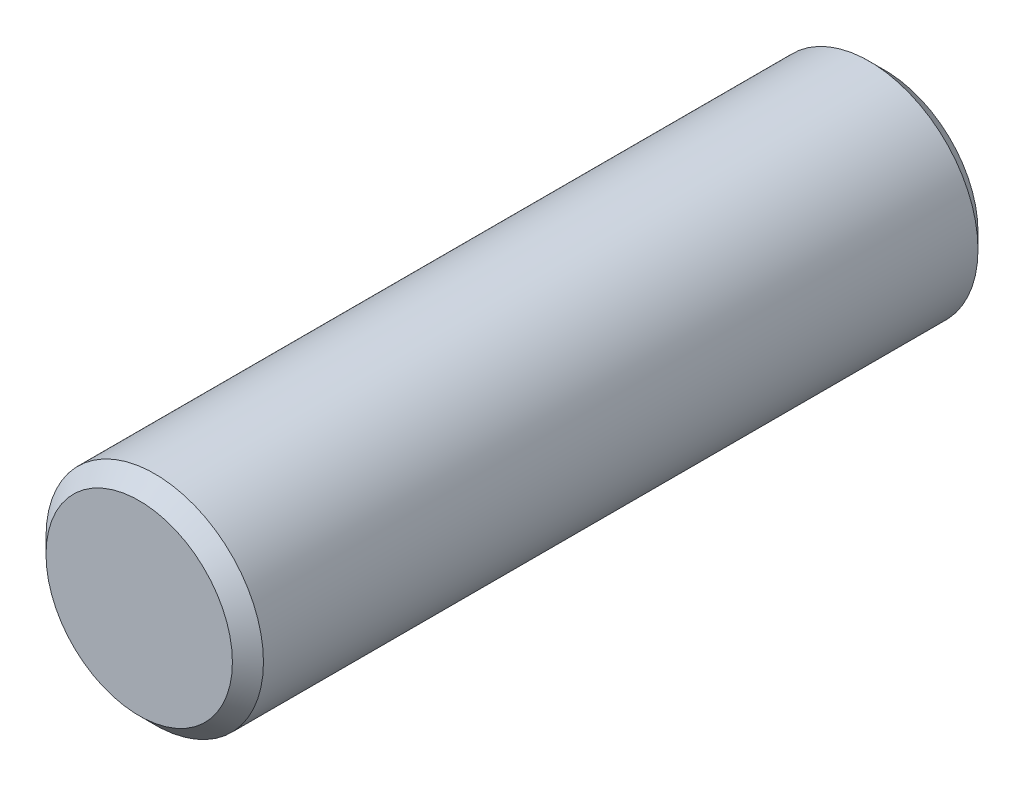
ISO-10303-21;
HEADER;
FILE_DESCRIPTION(('STEP AP214'),'2;1');
FILE_NAME('part.step','',(''),(''),'','','');
FILE_SCHEMA(('AUTOMOTIVE_DESIGN { 1 0 10303 214 1 1 1 1 }'));
ENDSEC;
DATA;
#1=APPLICATION_CONTEXT('core data for automotive mechanical design processes');
#2=APPLICATION_PROTOCOL_DEFINITION('international standard','automotive_design',2000,#1);
#3=PRODUCT_CONTEXT('',#1,'mechanical');
#4=PRODUCT('Part','Part','',(#3));
#5=PRODUCT_RELATED_PRODUCT_CATEGORY('part','',(#4));
#6=PRODUCT_DEFINITION_FORMATION('','',#4);
#7=PRODUCT_DEFINITION_CONTEXT('part definition',#1,'design');
#8=PRODUCT_DEFINITION('design','',#6,#7);
#9=PRODUCT_DEFINITION_SHAPE('','',#8);
#10=(LENGTH_UNIT() NAMED_UNIT(*) SI_UNIT(.MILLI.,.METRE.));
#11=(NAMED_UNIT(*) PLANE_ANGLE_UNIT() SI_UNIT($,.RADIAN.));
#12=(NAMED_UNIT(*) SI_UNIT($,.STERADIAN.) SOLID_ANGLE_UNIT());
#13=UNCERTAINTY_MEASURE_WITH_UNIT(LENGTH_MEASURE(1.E-05),#10,'distance_accuracy_value','');
#14=(GEOMETRIC_REPRESENTATION_CONTEXT(3) GLOBAL_UNCERTAINTY_ASSIGNED_CONTEXT((#13)) GLOBAL_UNIT_ASSIGNED_CONTEXT((#10,
#11,#12)) REPRESENTATION_CONTEXT('',''));
#15=CARTESIAN_POINT('',(0.,0.,0.));
#16=DIRECTION('',(0.,0.,1.));
#17=DIRECTION('',(1.,0.,0.));
#18=AXIS2_PLACEMENT_3D('',#15,#16,#17);
#19=CARTESIAN_POINT('',(0.,0.,24.));
#20=DIRECTION('',(0.,0.,-1.));
#21=DIRECTION('',(-1.,0.,0.));
#22=AXIS2_PLACEMENT_3D('',#19,#20,#21);
#23=CYLINDRICAL_SURFACE('',#22,3.5);
#24=CARTESIAN_POINT('',(0.,0.,23.5));
#25=DIRECTION('',(0.,0.,1.));
#26=DIRECTION('',(1.,0.,0.));
#27=AXIS2_PLACEMENT_3D('',#24,#25,#26);
#28=CIRCLE('',#27,3.5);
#29=CARTESIAN_POINT('',(3.5,0.,23.5));
#30=VERTEX_POINT('',#29);
#31=EDGE_CURVE('E38',#30,#30,#28,.F.);
#32=ORIENTED_EDGE('',*,*,#31,.T.);
#33=EDGE_LOOP('',(#32));
#34=FACE_BOUND('',#33,.T.);
#35=CARTESIAN_POINT('',(0.,0.,0.500000000000004));
#36=DIRECTION('',(0.,0.,1.));
#37=DIRECTION('',(1.,0.,0.));
#38=AXIS2_PLACEMENT_3D('',#35,#36,#37);
#39=CIRCLE('',#38,3.5);
#40=CARTESIAN_POINT('',(3.5,0.,0.500000000000004));
#41=VERTEX_POINT('',#40);
#42=EDGE_CURVE('E42',#41,#41,#39,.T.);
#43=ORIENTED_EDGE('',*,*,#42,.T.);
#44=EDGE_LOOP('',(#43));
#45=FACE_BOUND('',#44,.T.);
#46=ADVANCED_FACE('F31',(#34,#45),#23,.T.);
#47=CARTESIAN_POINT('',(0.,0.,24.));
#48=DIRECTION('',(0.,0.,1.));
#49=DIRECTION('',(1.,0.,0.));
#50=AXIS2_PLACEMENT_3D('',#47,#48,#49);
#51=PLANE('',#50);
#52=CARTESIAN_POINT('',(0.,0.,24.));
#53=DIRECTION('',(0.,0.,1.));
#54=DIRECTION('',(1.,0.,0.));
#55=AXIS2_PLACEMENT_3D('',#52,#53,#54);
#56=CIRCLE('',#55,3.);
#57=CARTESIAN_POINT('',(3.,0.,24.));
#58=VERTEX_POINT('',#57);
#59=EDGE_CURVE('E46',#58,#58,#56,.T.);
#60=ORIENTED_EDGE('',*,*,#59,.T.);
#61=EDGE_LOOP('',(#60));
#62=FACE_BOUND('',#61,.T.);
#63=ADVANCED_FACE('F52',(#62),#51,.T.);
#64=CARTESIAN_POINT('',(0.,0.,0.));
#65=DIRECTION('',(0.,0.,1.));
#66=DIRECTION('',(1.,0.,0.));
#67=AXIS2_PLACEMENT_3D('',#64,#65,#66);
#68=PLANE('',#67);
#69=CARTESIAN_POINT('',(0.,0.,0.));
#70=DIRECTION('',(0.,0.,1.));
#71=DIRECTION('',(1.,0.,0.));
#72=AXIS2_PLACEMENT_3D('',#69,#70,#71);
#73=CIRCLE('',#72,2.99999999999999);
#74=CARTESIAN_POINT('',(2.99999999999999,0.,0.));
#75=VERTEX_POINT('',#74);
#76=EDGE_CURVE('E10',#75,#75,#73,.F.);
#77=ORIENTED_EDGE('',*,*,#76,.T.);
#78=EDGE_LOOP('',(#77));
#79=FACE_BOUND('',#78,.T.);
#80=ADVANCED_FACE('F56',(#79),#68,.F.);
#81=CARTESIAN_POINT('',(0.,0.,24.));
#82=DIRECTION('',(0.,0.,-1.));
#83=DIRECTION('',(-1.,0.,0.));
#84=AXIS2_PLACEMENT_3D('',#81,#82,#83);
#85=CONICAL_SURFACE('',#84,3.,0.785398163397445);
#86=ORIENTED_EDGE('',*,*,#31,.F.);
#87=EDGE_LOOP('',(#86));
#88=FACE_BOUND('',#87,.T.);
#89=ORIENTED_EDGE('',*,*,#59,.F.);
#90=EDGE_LOOP('',(#89));
#91=FACE_BOUND('',#90,.T.);
#92=ADVANCED_FACE('F54',(#88,#91),#85,.T.);
#93=CARTESIAN_POINT('',(0.,0.,0.500000000000004));
#94=DIRECTION('',(0.,0.,1.));
#95=DIRECTION('',(1.,0.,0.));
#96=AXIS2_PLACEMENT_3D('',#93,#94,#95);
#97=CONICAL_SURFACE('',#96,3.5,0.78539816339745);
#98=ORIENTED_EDGE('',*,*,#76,.F.);
#99=EDGE_LOOP('',(#98));
#100=FACE_BOUND('',#99,.T.);
#101=ORIENTED_EDGE('',*,*,#42,.F.);
#102=EDGE_LOOP('',(#101));
#103=FACE_BOUND('',#102,.T.);
#104=ADVANCED_FACE('F33',(#100,#103),#97,.T.);
#105=CLOSED_SHELL('',(#46,#63,#80,#92,#104));
#106=MANIFOLD_SOLID_BREP('B2',#105);
#107=ADVANCED_BREP_SHAPE_REPRESENTATION('',(#18,#106),#14);
#108=SHAPE_DEFINITION_REPRESENTATION(#9,#107);
ENDSEC;
END-ISO-10303-21;
